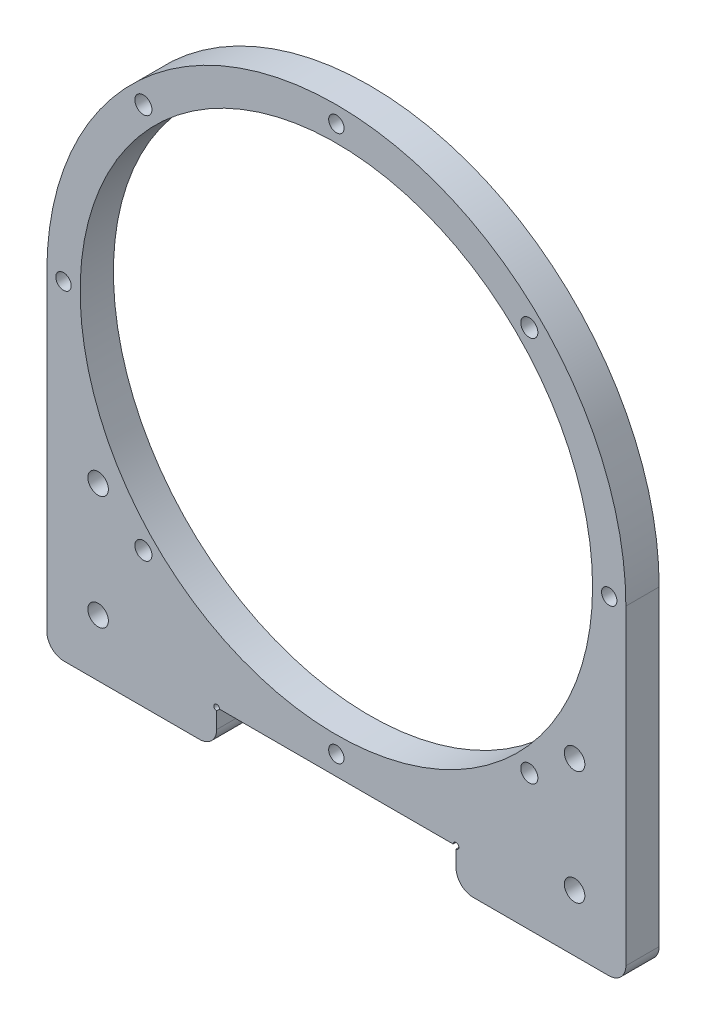
ISO-10303-21;
HEADER;
FILE_DESCRIPTION(('STEP AP214'),'2;1');
FILE_NAME('part.step','',(''),(''),'','','');
FILE_SCHEMA(('AUTOMOTIVE_DESIGN { 1 0 10303 214 1 1 1 1 }'));
ENDSEC;
DATA;
#1=APPLICATION_CONTEXT('core data for automotive mechanical design processes');
#2=APPLICATION_PROTOCOL_DEFINITION('international standard','automotive_design',2000,#1);
#3=PRODUCT_CONTEXT('',#1,'mechanical');
#4=PRODUCT('Part','Part','',(#3));
#5=PRODUCT_RELATED_PRODUCT_CATEGORY('part','',(#4));
#6=PRODUCT_DEFINITION_FORMATION('','',#4);
#7=PRODUCT_DEFINITION_CONTEXT('part definition',#1,'design');
#8=PRODUCT_DEFINITION('design','',#6,#7);
#9=PRODUCT_DEFINITION_SHAPE('','',#8);
#10=(LENGTH_UNIT() NAMED_UNIT(*) SI_UNIT(.MILLI.,.METRE.));
#11=(NAMED_UNIT(*) PLANE_ANGLE_UNIT() SI_UNIT($,.RADIAN.));
#12=(NAMED_UNIT(*) SI_UNIT($,.STERADIAN.) SOLID_ANGLE_UNIT());
#13=UNCERTAINTY_MEASURE_WITH_UNIT(LENGTH_MEASURE(1.E-05),#10,'distance_accuracy_value','');
#14=(GEOMETRIC_REPRESENTATION_CONTEXT(3) GLOBAL_UNCERTAINTY_ASSIGNED_CONTEXT((#13)) GLOBAL_UNIT_ASSIGNED_CONTEXT((#10,
#11,#12)) REPRESENTATION_CONTEXT('',''));
#15=CARTESIAN_POINT('',(0.,0.,0.));
#16=DIRECTION('',(0.,0.,1.));
#17=DIRECTION('',(1.,0.,0.));
#18=AXIS2_PLACEMENT_3D('',#15,#16,#17);
#19=CARTESIAN_POINT('',(0.,-57.658,5.842));
#20=DIRECTION('',(0.,1.,0.));
#21=DIRECTION('',(-1.,0.,0.));
#22=AXIS2_PLACEMENT_3D('',#19,#20,#21);
#23=PLANE('',#22);
#24=DIRECTION('',(1.,0.,0.));
#25=VECTOR('',#24,1.);
#26=CARTESIAN_POINT('',(0.,-57.658,0.));
#27=LINE('',#26,#25);
#28=CARTESIAN_POINT('',(-47.8,-57.658,0.));
#29=VERTEX_POINT('',#28);
#30=CARTESIAN_POINT('',(-24.,-57.658,0.));
#31=VERTEX_POINT('',#30);
#32=EDGE_CURVE('E262',#29,#31,#27,.T.);
#33=ORIENTED_EDGE('',*,*,#32,.T.);
#34=DIRECTION('',(0.,0.,1.));
#35=VECTOR('',#34,1.);
#36=CARTESIAN_POINT('',(-24.,-57.658,5.842));
#37=LINE('',#36,#35);
#38=CARTESIAN_POINT('',(-24.,-57.658,5.842));
#39=VERTEX_POINT('',#38);
#40=EDGE_CURVE('E308',#31,#39,#37,.T.);
#41=ORIENTED_EDGE('',*,*,#40,.T.);
#42=DIRECTION('',(1.,0.,0.));
#43=VECTOR('',#42,1.);
#44=CARTESIAN_POINT('',(0.,-57.658,5.842));
#45=LINE('',#44,#43);
#46=CARTESIAN_POINT('',(-47.8,-57.658,5.842));
#47=VERTEX_POINT('',#46);
#48=EDGE_CURVE('E208',#47,#39,#45,.T.);
#49=ORIENTED_EDGE('',*,*,#48,.F.);
#50=DIRECTION('',(0.,0.,-1.));
#51=VECTOR('',#50,1.);
#52=CARTESIAN_POINT('',(-47.8,-57.658,5.842));
#53=LINE('',#52,#51);
#54=EDGE_CURVE('E305',#47,#29,#53,.T.);
#55=ORIENTED_EDGE('',*,*,#54,.T.);
#56=EDGE_LOOP('',(#33,#41,#49,#55));
#57=FACE_BOUND('',#56,.T.);
#58=ADVANCED_FACE('F34',(#57),#23,.F.);
#59=CARTESIAN_POINT('',(0.,0.,5.842));
#60=DIRECTION('',(0.,0.,-1.));
#61=DIRECTION('',(-1.,0.,0.));
#62=AXIS2_PLACEMENT_3D('',#59,#60,#61);
#63=CYLINDRICAL_SURFACE('',#62,50.8);
#64=CARTESIAN_POINT('',(0.,0.,0.));
#65=DIRECTION('',(0.,0.,1.));
#66=DIRECTION('',(1.,0.,0.));
#67=AXIS2_PLACEMENT_3D('',#64,#65,#66);
#68=CIRCLE('',#67,50.8);
#69=CARTESIAN_POINT('',(-50.8,0.,0.));
#70=VERTEX_POINT('',#69);
#71=CARTESIAN_POINT('',(50.8,0.,0.));
#72=VERTEX_POINT('',#71);
#73=EDGE_CURVE('E253',#70,#72,#68,.F.);
#74=ORIENTED_EDGE('',*,*,#73,.F.);
#75=DIRECTION('',(0.,0.,-1.));
#76=VECTOR('',#75,1.);
#77=CARTESIAN_POINT('',(-50.8,0.,5.842));
#78=LINE('',#77,#76);
#79=CARTESIAN_POINT('',(-50.8,0.,5.842));
#80=VERTEX_POINT('',#79);
#81=EDGE_CURVE('E275',#80,#70,#78,.T.);
#82=ORIENTED_EDGE('',*,*,#81,.F.);
#83=CARTESIAN_POINT('',(0.,0.,5.842));
#84=DIRECTION('',(0.,0.,1.));
#85=DIRECTION('',(1.,0.,0.));
#86=AXIS2_PLACEMENT_3D('',#83,#84,#85);
#87=CIRCLE('',#86,50.8);
#88=CARTESIAN_POINT('',(50.8,0.,5.842));
#89=VERTEX_POINT('',#88);
#90=EDGE_CURVE('E201',#80,#89,#87,.F.);
#91=ORIENTED_EDGE('',*,*,#90,.T.);
#92=DIRECTION('',(0.,0.,-1.));
#93=VECTOR('',#92,1.);
#94=CARTESIAN_POINT('',(50.8,0.,5.842));
#95=LINE('',#94,#93);
#96=EDGE_CURVE('E222',#89,#72,#95,.T.);
#97=ORIENTED_EDGE('',*,*,#96,.T.);
#98=EDGE_LOOP('',(#74,#82,#91,#97));
#99=FACE_BOUND('',#98,.T.);
#100=ADVANCED_FACE('F336',(#99),#63,.T.);
#101=CARTESIAN_POINT('',(-50.8,0.,5.842));
#102=DIRECTION('',(1.,0.,0.));
#103=DIRECTION('',(0.,1.,0.));
#104=AXIS2_PLACEMENT_3D('',#101,#102,#103);
#105=PLANE('',#104);
#106=DIRECTION('',(0.,-1.,0.));
#107=VECTOR('',#106,1.);
#108=CARTESIAN_POINT('',(-50.8,0.,0.));
#109=LINE('',#108,#107);
#110=CARTESIAN_POINT('',(-50.8,-54.658,0.));
#111=VERTEX_POINT('',#110);
#112=EDGE_CURVE('E256',#70,#111,#109,.T.);
#113=ORIENTED_EDGE('',*,*,#112,.T.);
#114=DIRECTION('',(0.,0.,-1.));
#115=VECTOR('',#114,1.);
#116=CARTESIAN_POINT('',(-50.8,-54.658,5.842));
#117=LINE('',#116,#115);
#118=CARTESIAN_POINT('',(-50.8,-54.658,5.842));
#119=VERTEX_POINT('',#118);
#120=EDGE_CURVE('E11',#111,#119,#117,.F.);
#121=ORIENTED_EDGE('',*,*,#120,.T.);
#122=DIRECTION('',(0.,-1.,0.));
#123=VECTOR('',#122,1.);
#124=CARTESIAN_POINT('',(-50.8,0.,5.842));
#125=LINE('',#124,#123);
#126=EDGE_CURVE('E204',#80,#119,#125,.T.);
#127=ORIENTED_EDGE('',*,*,#126,.F.);
#128=ORIENTED_EDGE('',*,*,#81,.T.);
#129=EDGE_LOOP('',(#113,#121,#127,#128));
#130=FACE_BOUND('',#129,.T.);
#131=ADVANCED_FACE('F334',(#130),#105,.F.);
#132=CARTESIAN_POINT('',(24.,-57.658,0.));
#133=VERTEX_POINT('',#132);
#134=CARTESIAN_POINT('',(47.8,-57.658,0.));
#135=VERTEX_POINT('',#134);
#136=EDGE_CURVE('E259',#133,#135,#27,.T.);
#137=ORIENTED_EDGE('',*,*,#136,.T.);
#138=DIRECTION('',(0.,0.,-1.));
#139=VECTOR('',#138,1.);
#140=CARTESIAN_POINT('',(47.8,-57.658,5.842));
#141=LINE('',#140,#139);
#142=CARTESIAN_POINT('',(47.8,-57.658,5.842));
#143=VERTEX_POINT('',#142);
#144=EDGE_CURVE('E293',#135,#143,#141,.F.);
#145=ORIENTED_EDGE('',*,*,#144,.T.);
#146=CARTESIAN_POINT('',(24.,-57.658,5.842));
#147=VERTEX_POINT('',#146);
#148=EDGE_CURVE('E207',#147,#143,#45,.T.);
#149=ORIENTED_EDGE('',*,*,#148,.F.);
#150=DIRECTION('',(0.,0.,1.));
#151=VECTOR('',#150,1.);
#152=CARTESIAN_POINT('',(24.,-57.658,5.842));
#153=LINE('',#152,#151);
#154=EDGE_CURVE('E291',#147,#133,#153,.F.);
#155=ORIENTED_EDGE('',*,*,#154,.T.);
#156=EDGE_LOOP('',(#137,#145,#149,#155));
#157=FACE_BOUND('',#156,.T.);
#158=ADVANCED_FACE('F349',(#157),#23,.F.);
#159=CARTESIAN_POINT('',(0.,47.879,5.842));
#160=DIRECTION('',(0.,0.,-1.));
#161=DIRECTION('',(-1.,0.,0.));
#162=AXIS2_PLACEMENT_3D('',#159,#160,#161);
#163=CYLINDRICAL_SURFACE('',#162,1.35);
#164=CARTESIAN_POINT('',(0.,47.879,5.842));
#165=DIRECTION('',(0.,0.,1.));
#166=DIRECTION('',(1.,0.,0.));
#167=AXIS2_PLACEMENT_3D('',#164,#165,#166);
#168=CIRCLE('',#167,1.35);
#169=CARTESIAN_POINT('',(1.35,47.879,5.842));
#170=VERTEX_POINT('',#169);
#171=EDGE_CURVE('E216',#170,#170,#168,.T.);
#172=ORIENTED_EDGE('',*,*,#171,.T.);
#173=EDGE_LOOP('',(#172));
#174=FACE_BOUND('',#173,.T.);
#175=CARTESIAN_POINT('',(0.,47.879,0.));
#176=DIRECTION('',(0.,0.,1.));
#177=DIRECTION('',(1.,0.,0.));
#178=AXIS2_PLACEMENT_3D('',#175,#176,#177);
#179=CIRCLE('',#178,1.35);
#180=CARTESIAN_POINT('',(1.35,47.879,0.));
#181=VERTEX_POINT('',#180);
#182=EDGE_CURVE('E269',#181,#181,#179,.T.);
#183=ORIENTED_EDGE('',*,*,#182,.F.);
#184=EDGE_LOOP('',(#183));
#185=FACE_BOUND('',#184,.T.);
#186=ADVANCED_FACE('F385',(#174,#185),#163,.F.);
#187=CARTESIAN_POINT('',(-47.879,0.,5.842));
#188=DIRECTION('',(0.,0.,-1.));
#189=DIRECTION('',(-1.,0.,0.));
#190=AXIS2_PLACEMENT_3D('',#187,#188,#189);
#191=CYLINDRICAL_SURFACE('',#190,1.35);
#192=CARTESIAN_POINT('',(-47.879,0.,5.842));
#193=DIRECTION('',(0.,0.,1.));
#194=DIRECTION('',(1.,0.,0.));
#195=AXIS2_PLACEMENT_3D('',#192,#193,#194);
#196=CIRCLE('',#195,1.35);
#197=CARTESIAN_POINT('',(-46.529,0.,5.842));
#198=VERTEX_POINT('',#197);
#199=EDGE_CURVE('E213',#198,#198,#196,.T.);
#200=ORIENTED_EDGE('',*,*,#199,.T.);
#201=EDGE_LOOP('',(#200));
#202=FACE_BOUND('',#201,.T.);
#203=CARTESIAN_POINT('',(-47.879,0.,0.));
#204=DIRECTION('',(0.,0.,1.));
#205=DIRECTION('',(1.,0.,0.));
#206=AXIS2_PLACEMENT_3D('',#203,#204,#205);
#207=CIRCLE('',#206,1.35);
#208=CARTESIAN_POINT('',(-46.529,0.,0.));
#209=VERTEX_POINT('',#208);
#210=EDGE_CURVE('E266',#209,#209,#207,.T.);
#211=ORIENTED_EDGE('',*,*,#210,.F.);
#212=EDGE_LOOP('',(#211));
#213=FACE_BOUND('',#212,.T.);
#214=ADVANCED_FACE('F390',(#202,#213),#191,.F.);
#215=CARTESIAN_POINT('',(50.8,0.,5.842));
#216=DIRECTION('',(1.,0.,0.));
#217=DIRECTION('',(0.,1.,0.));
#218=AXIS2_PLACEMENT_3D('',#215,#216,#217);
#219=PLANE('',#218);
#220=DIRECTION('',(0.,-1.,0.));
#221=VECTOR('',#220,1.);
#222=CARTESIAN_POINT('',(50.8,0.,5.842));
#223=LINE('',#222,#221);
#224=CARTESIAN_POINT('',(50.8,-54.658,5.842));
#225=VERTEX_POINT('',#224);
#226=EDGE_CURVE('E210',#89,#225,#223,.T.);
#227=ORIENTED_EDGE('',*,*,#226,.T.);
#228=DIRECTION('',(0.,0.,-1.));
#229=VECTOR('',#228,1.);
#230=CARTESIAN_POINT('',(50.8,-54.658,0.));
#231=LINE('',#230,#229);
#232=CARTESIAN_POINT('',(50.8,-54.658,0.));
#233=VERTEX_POINT('',#232);
#234=EDGE_CURVE('E280',#225,#233,#231,.T.);
#235=ORIENTED_EDGE('',*,*,#234,.T.);
#236=DIRECTION('',(0.,-1.,0.));
#237=VECTOR('',#236,1.);
#238=CARTESIAN_POINT('',(50.8,0.,0.));
#239=LINE('',#238,#237);
#240=EDGE_CURVE('E263',#72,#233,#239,.T.);
#241=ORIENTED_EDGE('',*,*,#240,.F.);
#242=ORIENTED_EDGE('',*,*,#96,.F.);
#243=EDGE_LOOP('',(#227,#235,#241,#242));
#244=FACE_BOUND('',#243,.T.);
#245=ADVANCED_FACE('F340',(#244),#219,.T.);
#246=CARTESIAN_POINT('',(0.,0.,5.842));
#247=DIRECTION('',(0.,0.,-1.));
#248=DIRECTION('',(-1.,0.,0.));
#249=AXIS2_PLACEMENT_3D('',#246,#247,#248);
#250=CYLINDRICAL_SURFACE('',#249,44.958);
#251=CARTESIAN_POINT('',(0.,0.,5.842));
#252=DIRECTION('',(0.,0.,1.));
#253=DIRECTION('',(1.,0.,0.));
#254=AXIS2_PLACEMENT_3D('',#251,#252,#253);
#255=CIRCLE('',#254,44.958);
#256=CARTESIAN_POINT('',(44.958,0.,5.842));
#257=VERTEX_POINT('',#256);
#258=EDGE_CURVE('E198',#257,#257,#255,.T.);
#259=ORIENTED_EDGE('',*,*,#258,.T.);
#260=EDGE_LOOP('',(#259));
#261=FACE_BOUND('',#260,.T.);
#262=CARTESIAN_POINT('',(0.,0.,0.));
#263=DIRECTION('',(0.,0.,1.));
#264=DIRECTION('',(1.,0.,0.));
#265=AXIS2_PLACEMENT_3D('',#262,#263,#264);
#266=CIRCLE('',#265,44.958);
#267=CARTESIAN_POINT('',(44.958,0.,0.));
#268=VERTEX_POINT('',#267);
#269=EDGE_CURVE('E250',#268,#268,#266,.T.);
#270=ORIENTED_EDGE('',*,*,#269,.F.);
#271=EDGE_LOOP('',(#270));
#272=FACE_BOUND('',#271,.T.);
#273=ADVANCED_FACE('F396',(#261,#272),#250,.F.);
#274=CARTESIAN_POINT('',(41.8,-47.658,5.842));
#275=DIRECTION('',(0.,0.,-1.));
#276=DIRECTION('',(-1.,0.,0.));
#277=AXIS2_PLACEMENT_3D('',#274,#275,#276);
#278=CYLINDRICAL_SURFACE('',#277,1.8);
#279=CARTESIAN_POINT('',(41.8,-47.658,5.842));
#280=DIRECTION('',(0.,0.,1.));
#281=DIRECTION('',(1.,0.,0.));
#282=AXIS2_PLACEMENT_3D('',#279,#280,#281);
#283=CIRCLE('',#282,1.8);
#284=CARTESIAN_POINT('',(43.6,-47.658,5.842));
#285=VERTEX_POINT('',#284);
#286=EDGE_CURVE('E195',#285,#285,#283,.F.);
#287=ORIENTED_EDGE('',*,*,#286,.F.);
#288=EDGE_LOOP('',(#287));
#289=FACE_BOUND('',#288,.T.);
#290=CARTESIAN_POINT('',(41.8,-47.658,0.));
#291=DIRECTION('',(0.,0.,1.));
#292=DIRECTION('',(1.,0.,0.));
#293=AXIS2_PLACEMENT_3D('',#290,#291,#292);
#294=CIRCLE('',#293,1.8);
#295=CARTESIAN_POINT('',(43.6,-47.658,0.));
#296=VERTEX_POINT('',#295);
#297=EDGE_CURVE('E247',#296,#296,#294,.F.);
#298=ORIENTED_EDGE('',*,*,#297,.T.);
#299=EDGE_LOOP('',(#298));
#300=FACE_BOUND('',#299,.T.);
#301=ADVANCED_FACE('F399',(#289,#300),#278,.F.);
#302=CARTESIAN_POINT('',(47.879,0.,5.842));
#303=DIRECTION('',(0.,0.,-1.));
#304=DIRECTION('',(-1.,0.,0.));
#305=AXIS2_PLACEMENT_3D('',#302,#303,#304);
#306=CYLINDRICAL_SURFACE('',#305,1.35);
#307=CARTESIAN_POINT('',(47.879,0.,5.842));
#308=DIRECTION('',(0.,0.,1.));
#309=DIRECTION('',(1.,0.,0.));
#310=AXIS2_PLACEMENT_3D('',#307,#308,#309);
#311=CIRCLE('',#310,1.35);
#312=CARTESIAN_POINT('',(49.229,0.,5.842));
#313=VERTEX_POINT('',#312);
#314=EDGE_CURVE('E192',#313,#313,#311,.T.);
#315=ORIENTED_EDGE('',*,*,#314,.T.);
#316=EDGE_LOOP('',(#315));
#317=FACE_BOUND('',#316,.T.);
#318=CARTESIAN_POINT('',(47.879,0.,0.));
#319=DIRECTION('',(0.,0.,1.));
#320=DIRECTION('',(1.,0.,0.));
#321=AXIS2_PLACEMENT_3D('',#318,#319,#320);
#322=CIRCLE('',#321,1.35);
#323=CARTESIAN_POINT('',(49.229,0.,0.));
#324=VERTEX_POINT('',#323);
#325=EDGE_CURVE('E244',#324,#324,#322,.T.);
#326=ORIENTED_EDGE('',*,*,#325,.F.);
#327=EDGE_LOOP('',(#326));
#328=FACE_BOUND('',#327,.T.);
#329=ADVANCED_FACE('F403',(#317,#328),#306,.F.);
#330=CARTESIAN_POINT('',(0.,-47.879,5.842));
#331=DIRECTION('',(0.,0.,-1.));
#332=DIRECTION('',(-1.,0.,0.));
#333=AXIS2_PLACEMENT_3D('',#330,#331,#332);
#334=CYLINDRICAL_SURFACE('',#333,1.35);
#335=CARTESIAN_POINT('',(0.,-47.879,5.842));
#336=DIRECTION('',(0.,0.,1.));
#337=DIRECTION('',(1.,0.,0.));
#338=AXIS2_PLACEMENT_3D('',#335,#336,#337);
#339=CIRCLE('',#338,1.35);
#340=CARTESIAN_POINT('',(1.35000000000001,-47.879,5.842));
#341=VERTEX_POINT('',#340);
#342=EDGE_CURVE('E189',#341,#341,#339,.T.);
#343=ORIENTED_EDGE('',*,*,#342,.T.);
#344=EDGE_LOOP('',(#343));
#345=FACE_BOUND('',#344,.T.);
#346=CARTESIAN_POINT('',(0.,-47.879,0.));
#347=DIRECTION('',(0.,0.,1.));
#348=DIRECTION('',(1.,0.,0.));
#349=AXIS2_PLACEMENT_3D('',#346,#347,#348);
#350=CIRCLE('',#349,1.35);
#351=CARTESIAN_POINT('',(1.35000000000001,-47.879,0.));
#352=VERTEX_POINT('',#351);
#353=EDGE_CURVE('E241',#352,#352,#350,.T.);
#354=ORIENTED_EDGE('',*,*,#353,.F.);
#355=EDGE_LOOP('',(#354));
#356=FACE_BOUND('',#355,.T.);
#357=ADVANCED_FACE('F407',(#345,#356),#334,.F.);
#358=CARTESIAN_POINT('',(-41.8,-27.658,5.842));
#359=DIRECTION('',(0.,0.,-1.));
#360=DIRECTION('',(-1.,0.,0.));
#361=AXIS2_PLACEMENT_3D('',#358,#359,#360);
#362=CYLINDRICAL_SURFACE('',#361,1.8);
#363=CARTESIAN_POINT('',(-41.8,-27.658,5.842));
#364=DIRECTION('',(0.,0.,1.));
#365=DIRECTION('',(1.,0.,0.));
#366=AXIS2_PLACEMENT_3D('',#363,#364,#365);
#367=CIRCLE('',#366,1.8);
#368=CARTESIAN_POINT('',(-40.,-27.658,5.842));
#369=VERTEX_POINT('',#368);
#370=EDGE_CURVE('E186',#369,#369,#367,.T.);
#371=ORIENTED_EDGE('',*,*,#370,.T.);
#372=EDGE_LOOP('',(#371));
#373=FACE_BOUND('',#372,.T.);
#374=CARTESIAN_POINT('',(-41.8,-27.658,0.));
#375=DIRECTION('',(0.,0.,1.));
#376=DIRECTION('',(1.,0.,0.));
#377=AXIS2_PLACEMENT_3D('',#374,#375,#376);
#378=CIRCLE('',#377,1.8);
#379=CARTESIAN_POINT('',(-40.,-27.658,0.));
#380=VERTEX_POINT('',#379);
#381=EDGE_CURVE('E238',#380,#380,#378,.T.);
#382=ORIENTED_EDGE('',*,*,#381,.F.);
#383=EDGE_LOOP('',(#382));
#384=FACE_BOUND('',#383,.T.);
#385=ADVANCED_FACE('F411',(#373,#384),#362,.F.);
#386=CARTESIAN_POINT('',(-33.8555655764305,33.8555655764309,5.842));
#387=DIRECTION('',(0.,0.,-1.));
#388=DIRECTION('',(-1.,0.,0.));
#389=AXIS2_PLACEMENT_3D('',#386,#387,#388);
#390=CYLINDRICAL_SURFACE('',#389,1.5);
#391=CARTESIAN_POINT('',(-33.8555655764305,33.8555655764309,5.842));
#392=DIRECTION('',(0.,0.,1.));
#393=DIRECTION('',(1.,0.,0.));
#394=AXIS2_PLACEMENT_3D('',#391,#392,#393);
#395=CIRCLE('',#394,1.5);
#396=CARTESIAN_POINT('',(-32.3555655764305,33.8555655764309,5.842));
#397=VERTEX_POINT('',#396);
#398=EDGE_CURVE('E183',#397,#397,#395,.T.);
#399=ORIENTED_EDGE('',*,*,#398,.T.);
#400=EDGE_LOOP('',(#399));
#401=FACE_BOUND('',#400,.T.);
#402=CARTESIAN_POINT('',(-33.8555655764305,33.8555655764309,0.));
#403=DIRECTION('',(0.,0.,1.));
#404=DIRECTION('',(1.,0.,0.));
#405=AXIS2_PLACEMENT_3D('',#402,#403,#404);
#406=CIRCLE('',#405,1.5);
#407=CARTESIAN_POINT('',(-32.3555655764305,33.8555655764309,0.));
#408=VERTEX_POINT('',#407);
#409=EDGE_CURVE('E235',#408,#408,#406,.T.);
#410=ORIENTED_EDGE('',*,*,#409,.F.);
#411=EDGE_LOOP('',(#410));
#412=FACE_BOUND('',#411,.T.);
#413=ADVANCED_FACE('F415',(#401,#412),#390,.F.);
#414=CARTESIAN_POINT('',(33.8555655764309,33.8555655764305,5.842));
#415=DIRECTION('',(0.,0.,-1.));
#416=DIRECTION('',(-1.,0.,0.));
#417=AXIS2_PLACEMENT_3D('',#414,#415,#416);
#418=CYLINDRICAL_SURFACE('',#417,1.5);
#419=CARTESIAN_POINT('',(33.8555655764309,33.8555655764305,5.842));
#420=DIRECTION('',(0.,0.,1.));
#421=DIRECTION('',(1.,0.,0.));
#422=AXIS2_PLACEMENT_3D('',#419,#420,#421);
#423=CIRCLE('',#422,1.5);
#424=CARTESIAN_POINT('',(35.3555655764309,33.8555655764305,5.842));
#425=VERTEX_POINT('',#424);
#426=EDGE_CURVE('E180',#425,#425,#423,.T.);
#427=ORIENTED_EDGE('',*,*,#426,.T.);
#428=EDGE_LOOP('',(#427));
#429=FACE_BOUND('',#428,.T.);
#430=CARTESIAN_POINT('',(33.8555655764309,33.8555655764305,0.));
#431=DIRECTION('',(0.,0.,1.));
#432=DIRECTION('',(1.,0.,0.));
#433=AXIS2_PLACEMENT_3D('',#430,#431,#432);
#434=CIRCLE('',#433,1.5);
#435=CARTESIAN_POINT('',(35.3555655764309,33.8555655764305,0.));
#436=VERTEX_POINT('',#435);
#437=EDGE_CURVE('E232',#436,#436,#434,.T.);
#438=ORIENTED_EDGE('',*,*,#437,.F.);
#439=EDGE_LOOP('',(#438));
#440=FACE_BOUND('',#439,.T.);
#441=ADVANCED_FACE('F419',(#429,#440),#418,.F.);
#442=CARTESIAN_POINT('',(33.8555655764305,-33.8555655764309,5.842));
#443=DIRECTION('',(0.,0.,-1.));
#444=DIRECTION('',(-1.,0.,0.));
#445=AXIS2_PLACEMENT_3D('',#442,#443,#444);
#446=CYLINDRICAL_SURFACE('',#445,1.50000000000001);
#447=CARTESIAN_POINT('',(33.8555655764305,-33.8555655764309,5.842));
#448=DIRECTION('',(0.,0.,1.));
#449=DIRECTION('',(1.,0.,0.));
#450=AXIS2_PLACEMENT_3D('',#447,#448,#449);
#451=CIRCLE('',#450,1.50000000000001);
#452=CARTESIAN_POINT('',(35.3555655764305,-33.8555655764309,5.842));
#453=VERTEX_POINT('',#452);
#454=EDGE_CURVE('E177',#453,#453,#451,.T.);
#455=ORIENTED_EDGE('',*,*,#454,.T.);
#456=EDGE_LOOP('',(#455));
#457=FACE_BOUND('',#456,.T.);
#458=CARTESIAN_POINT('',(33.8555655764305,-33.8555655764309,0.));
#459=DIRECTION('',(0.,0.,1.));
#460=DIRECTION('',(1.,0.,0.));
#461=AXIS2_PLACEMENT_3D('',#458,#459,#460);
#462=CIRCLE('',#461,1.50000000000001);
#463=CARTESIAN_POINT('',(35.3555655764305,-33.8555655764309,0.));
#464=VERTEX_POINT('',#463);
#465=EDGE_CURVE('E229',#464,#464,#462,.T.);
#466=ORIENTED_EDGE('',*,*,#465,.F.);
#467=EDGE_LOOP('',(#466));
#468=FACE_BOUND('',#467,.T.);
#469=ADVANCED_FACE('F423',(#457,#468),#446,.F.);
#470=CARTESIAN_POINT('',(-33.8555655764309,-33.8555655764305,5.842));
#471=DIRECTION('',(0.,0.,-1.));
#472=DIRECTION('',(-1.,0.,0.));
#473=AXIS2_PLACEMENT_3D('',#470,#471,#472);
#474=CYLINDRICAL_SURFACE('',#473,1.50000000000001);
#475=CARTESIAN_POINT('',(-33.8555655764309,-33.8555655764305,5.842));
#476=DIRECTION('',(0.,0.,1.));
#477=DIRECTION('',(1.,0.,0.));
#478=AXIS2_PLACEMENT_3D('',#475,#476,#477);
#479=CIRCLE('',#478,1.50000000000001);
#480=CARTESIAN_POINT('',(-32.3555655764309,-33.8555655764305,5.842));
#481=VERTEX_POINT('',#480);
#482=EDGE_CURVE('E173',#481,#481,#479,.T.);
#483=ORIENTED_EDGE('',*,*,#482,.T.);
#484=EDGE_LOOP('',(#483));
#485=FACE_BOUND('',#484,.T.);
#486=CARTESIAN_POINT('',(-33.8555655764309,-33.8555655764305,0.));
#487=DIRECTION('',(0.,0.,1.));
#488=DIRECTION('',(1.,0.,0.));
#489=AXIS2_PLACEMENT_3D('',#486,#487,#488);
#490=CIRCLE('',#489,1.50000000000001);
#491=CARTESIAN_POINT('',(-32.3555655764309,-33.8555655764305,0.));
#492=VERTEX_POINT('',#491);
#493=EDGE_CURVE('E226',#492,#492,#490,.T.);
#494=ORIENTED_EDGE('',*,*,#493,.F.);
#495=EDGE_LOOP('',(#494));
#496=FACE_BOUND('',#495,.T.);
#497=ADVANCED_FACE('F427',(#485,#496),#474,.F.);
#498=CARTESIAN_POINT('',(-41.8,-47.658,5.842));
#499=DIRECTION('',(0.,0.,-1.));
#500=DIRECTION('',(-1.,0.,0.));
#501=AXIS2_PLACEMENT_3D('',#498,#499,#500);
#502=CYLINDRICAL_SURFACE('',#501,1.8);
#503=CARTESIAN_POINT('',(-41.8,-47.658,5.842));
#504=DIRECTION('',(0.,0.,1.));
#505=DIRECTION('',(1.,0.,0.));
#506=AXIS2_PLACEMENT_3D('',#503,#504,#505);
#507=CIRCLE('',#506,1.8);
#508=CARTESIAN_POINT('',(-40.,-47.658,5.842));
#509=VERTEX_POINT('',#508);
#510=EDGE_CURVE('E170',#509,#509,#507,.T.);
#511=ORIENTED_EDGE('',*,*,#510,.T.);
#512=EDGE_LOOP('',(#511));
#513=FACE_BOUND('',#512,.T.);
#514=CARTESIAN_POINT('',(-41.8,-47.658,0.));
#515=DIRECTION('',(0.,0.,1.));
#516=DIRECTION('',(1.,0.,0.));
#517=AXIS2_PLACEMENT_3D('',#514,#515,#516);
#518=CIRCLE('',#517,1.8);
#519=CARTESIAN_POINT('',(-40.,-47.658,0.));
#520=VERTEX_POINT('',#519);
#521=EDGE_CURVE('E223',#520,#520,#518,.T.);
#522=ORIENTED_EDGE('',*,*,#521,.F.);
#523=EDGE_LOOP('',(#522));
#524=FACE_BOUND('',#523,.T.);
#525=ADVANCED_FACE('F431',(#513,#524),#502,.F.);
#526=CARTESIAN_POINT('',(41.8,-27.658,5.842));
#527=DIRECTION('',(0.,0.,-1.));
#528=DIRECTION('',(-1.,0.,0.));
#529=AXIS2_PLACEMENT_3D('',#526,#527,#528);
#530=CYLINDRICAL_SURFACE('',#529,1.8);
#531=CARTESIAN_POINT('',(41.8,-27.658,5.842));
#532=DIRECTION('',(0.,0.,1.));
#533=DIRECTION('',(1.,0.,0.));
#534=AXIS2_PLACEMENT_3D('',#531,#532,#533);
#535=CIRCLE('',#534,1.8);
#536=CARTESIAN_POINT('',(43.6,-27.658,5.842));
#537=VERTEX_POINT('',#536);
#538=EDGE_CURVE('E219',#537,#537,#535,.F.);
#539=ORIENTED_EDGE('',*,*,#538,.F.);
#540=EDGE_LOOP('',(#539));
#541=FACE_BOUND('',#540,.T.);
#542=CARTESIAN_POINT('',(41.8,-27.658,0.));
#543=DIRECTION('',(0.,0.,1.));
#544=DIRECTION('',(1.,0.,0.));
#545=AXIS2_PLACEMENT_3D('',#542,#543,#544);
#546=CIRCLE('',#545,1.8);
#547=CARTESIAN_POINT('',(43.6,-27.658,0.));
#548=VERTEX_POINT('',#547);
#549=EDGE_CURVE('E174',#548,#548,#546,.F.);
#550=ORIENTED_EDGE('',*,*,#549,.T.);
#551=EDGE_LOOP('',(#550));
#552=FACE_BOUND('',#551,.T.);
#553=ADVANCED_FACE('F435',(#541,#552),#530,.F.);
#554=CARTESIAN_POINT('',(0.,0.,5.842));
#555=DIRECTION('',(0.,0.,1.));
#556=DIRECTION('',(1.,0.,0.));
#557=AXIS2_PLACEMENT_3D('',#554,#555,#556);
#558=PLANE('',#557);
#559=ORIENTED_EDGE('',*,*,#148,.T.);
#560=CARTESIAN_POINT('',(47.8,-54.658,5.842));
#561=DIRECTION('',(0.,0.,1.));
#562=DIRECTION('',(1.,0.,0.));
#563=AXIS2_PLACEMENT_3D('',#560,#561,#562);
#564=CIRCLE('',#563,3.);
#565=EDGE_CURVE('E300',#143,#225,#564,.T.);
#566=ORIENTED_EDGE('',*,*,#565,.T.);
#567=ORIENTED_EDGE('',*,*,#226,.F.);
#568=ORIENTED_EDGE('',*,*,#90,.F.);
#569=ORIENTED_EDGE('',*,*,#126,.T.);
#570=CARTESIAN_POINT('',(-47.8,-54.658,5.842));
#571=DIRECTION('',(0.,0.,1.));
#572=DIRECTION('',(1.,0.,0.));
#573=AXIS2_PLACEMENT_3D('',#570,#571,#572);
#574=CIRCLE('',#573,3.);
#575=EDGE_CURVE('E295',#119,#47,#574,.T.);
#576=ORIENTED_EDGE('',*,*,#575,.T.);
#577=ORIENTED_EDGE('',*,*,#48,.T.);
#578=CARTESIAN_POINT('',(-24.,-54.658,5.842));
#579=DIRECTION('',(0.,0.,1.));
#580=DIRECTION('',(1.,0.,0.));
#581=AXIS2_PLACEMENT_3D('',#578,#579,#580);
#582=CIRCLE('',#581,3.);
#583=CARTESIAN_POINT('',(-21.,-54.658,5.842));
#584=VERTEX_POINT('',#583);
#585=EDGE_CURVE('E49',#39,#584,#582,.T.);
#586=ORIENTED_EDGE('',*,*,#585,.T.);
#587=DIRECTION('',(0.,-1.,0.));
#588=VECTOR('',#587,1.);
#589=CARTESIAN_POINT('',(-21.,-57.658,5.842));
#590=LINE('',#589,#588);
#591=CARTESIAN_POINT('',(-21.,-51.808,5.842));
#592=VERTEX_POINT('',#591);
#593=EDGE_CURVE('E166',#592,#584,#590,.T.);
#594=ORIENTED_EDGE('',*,*,#593,.F.);
#595=CARTESIAN_POINT('',(-21.,-51.308,5.842));
#596=DIRECTION('',(0.,0.,1.));
#597=DIRECTION('',(1.,0.,0.));
#598=AXIS2_PLACEMENT_3D('',#595,#596,#597);
#599=CIRCLE('',#598,0.499999999999999);
#600=CARTESIAN_POINT('',(-20.5,-51.308,5.842));
#601=VERTEX_POINT('',#600);
#602=EDGE_CURVE('E154',#601,#592,#599,.T.);
#603=ORIENTED_EDGE('',*,*,#602,.F.);
#604=DIRECTION('',(-1.,0.,0.));
#605=VECTOR('',#604,1.);
#606=CARTESIAN_POINT('',(-21.,-51.308,5.842));
#607=LINE('',#606,#605);
#608=CARTESIAN_POINT('',(20.5,-51.308,5.842));
#609=VERTEX_POINT('',#608);
#610=EDGE_CURVE('E151',#609,#601,#607,.T.);
#611=ORIENTED_EDGE('',*,*,#610,.F.);
#612=CARTESIAN_POINT('',(21.,-51.308,5.842));
#613=DIRECTION('',(0.,0.,1.));
#614=DIRECTION('',(1.,0.,0.));
#615=AXIS2_PLACEMENT_3D('',#612,#613,#614);
#616=CIRCLE('',#615,0.499999999999999);
#617=CARTESIAN_POINT('',(21.,-51.808,5.842));
#618=VERTEX_POINT('',#617);
#619=EDGE_CURVE('E135',#618,#609,#616,.T.);
#620=ORIENTED_EDGE('',*,*,#619,.F.);
#621=DIRECTION('',(0.,1.,0.));
#622=VECTOR('',#621,1.);
#623=CARTESIAN_POINT('',(21.,-57.658,5.842));
#624=LINE('',#623,#622);
#625=CARTESIAN_POINT('',(21.,-54.658,5.842));
#626=VERTEX_POINT('',#625);
#627=EDGE_CURVE('E161',#626,#618,#624,.T.);
#628=ORIENTED_EDGE('',*,*,#627,.F.);
#629=CARTESIAN_POINT('',(24.,-54.658,5.842));
#630=DIRECTION('',(0.,0.,1.));
#631=DIRECTION('',(1.,0.,0.));
#632=AXIS2_PLACEMENT_3D('',#629,#630,#631);
#633=CIRCLE('',#632,3.);
#634=EDGE_CURVE('E298',#626,#147,#633,.T.);
#635=ORIENTED_EDGE('',*,*,#634,.T.);
#636=EDGE_LOOP('',(#559,#566,#567,#568,#569,#576,#577,#586,#594,#603,#611,#620,#628,#635));
#637=FACE_BOUND('',#636,.T.);
#638=ORIENTED_EDGE('',*,*,#510,.F.);
#639=EDGE_LOOP('',(#638));
#640=FACE_BOUND('',#639,.T.);
#641=ORIENTED_EDGE('',*,*,#482,.F.);
#642=EDGE_LOOP('',(#641));
#643=FACE_BOUND('',#642,.T.);
#644=ORIENTED_EDGE('',*,*,#454,.F.);
#645=EDGE_LOOP('',(#644));
#646=FACE_BOUND('',#645,.T.);
#647=ORIENTED_EDGE('',*,*,#426,.F.);
#648=EDGE_LOOP('',(#647));
#649=FACE_BOUND('',#648,.T.);
#650=ORIENTED_EDGE('',*,*,#398,.F.);
#651=EDGE_LOOP('',(#650));
#652=FACE_BOUND('',#651,.T.);
#653=ORIENTED_EDGE('',*,*,#370,.F.);
#654=EDGE_LOOP('',(#653));
#655=FACE_BOUND('',#654,.T.);
#656=ORIENTED_EDGE('',*,*,#342,.F.);
#657=EDGE_LOOP('',(#656));
#658=FACE_BOUND('',#657,.T.);
#659=ORIENTED_EDGE('',*,*,#314,.F.);
#660=EDGE_LOOP('',(#659));
#661=FACE_BOUND('',#660,.T.);
#662=ORIENTED_EDGE('',*,*,#286,.T.);
#663=EDGE_LOOP('',(#662));
#664=FACE_BOUND('',#663,.T.);
#665=ORIENTED_EDGE('',*,*,#258,.F.);
#666=EDGE_LOOP('',(#665));
#667=FACE_BOUND('',#666,.T.);
#668=ORIENTED_EDGE('',*,*,#199,.F.);
#669=EDGE_LOOP('',(#668));
#670=FACE_BOUND('',#669,.T.);
#671=ORIENTED_EDGE('',*,*,#171,.F.);
#672=EDGE_LOOP('',(#671));
#673=FACE_BOUND('',#672,.T.);
#674=ORIENTED_EDGE('',*,*,#538,.T.);
#675=EDGE_LOOP('',(#674));
#676=FACE_BOUND('',#675,.T.);
#677=ADVANCED_FACE('F158',(#637,#640,#643,#646,#649,#652,#655,#658,#661,#664,#667,#670,#673,
#676),#558,.T.);
#678=CARTESIAN_POINT('',(0.,0.,0.));
#679=DIRECTION('',(0.,0.,1.));
#680=DIRECTION('',(1.,0.,0.));
#681=AXIS2_PLACEMENT_3D('',#678,#679,#680);
#682=PLANE('',#681);
#683=ORIENTED_EDGE('',*,*,#521,.T.);
#684=EDGE_LOOP('',(#683));
#685=FACE_BOUND('',#684,.T.);
#686=ORIENTED_EDGE('',*,*,#493,.T.);
#687=EDGE_LOOP('',(#686));
#688=FACE_BOUND('',#687,.T.);
#689=ORIENTED_EDGE('',*,*,#465,.T.);
#690=EDGE_LOOP('',(#689));
#691=FACE_BOUND('',#690,.T.);
#692=ORIENTED_EDGE('',*,*,#437,.T.);
#693=EDGE_LOOP('',(#692));
#694=FACE_BOUND('',#693,.T.);
#695=ORIENTED_EDGE('',*,*,#409,.T.);
#696=EDGE_LOOP('',(#695));
#697=FACE_BOUND('',#696,.T.);
#698=ORIENTED_EDGE('',*,*,#381,.T.);
#699=EDGE_LOOP('',(#698));
#700=FACE_BOUND('',#699,.T.);
#701=ORIENTED_EDGE('',*,*,#353,.T.);
#702=EDGE_LOOP('',(#701));
#703=FACE_BOUND('',#702,.T.);
#704=ORIENTED_EDGE('',*,*,#325,.T.);
#705=EDGE_LOOP('',(#704));
#706=FACE_BOUND('',#705,.T.);
#707=ORIENTED_EDGE('',*,*,#297,.F.);
#708=EDGE_LOOP('',(#707));
#709=FACE_BOUND('',#708,.T.);
#710=ORIENTED_EDGE('',*,*,#269,.T.);
#711=EDGE_LOOP('',(#710));
#712=FACE_BOUND('',#711,.T.);
#713=ORIENTED_EDGE('',*,*,#240,.T.);
#714=CARTESIAN_POINT('',(47.8,-54.658,0.));
#715=DIRECTION('',(0.,0.,1.));
#716=DIRECTION('',(1.,0.,0.));
#717=AXIS2_PLACEMENT_3D('',#714,#715,#716);
#718=CIRCLE('',#717,3.);
#719=EDGE_CURVE('E289',#233,#135,#718,.F.);
#720=ORIENTED_EDGE('',*,*,#719,.T.);
#721=ORIENTED_EDGE('',*,*,#136,.F.);
#722=CARTESIAN_POINT('',(24.,-54.658,0.));
#723=DIRECTION('',(0.,0.,1.));
#724=DIRECTION('',(1.,0.,0.));
#725=AXIS2_PLACEMENT_3D('',#722,#723,#724);
#726=CIRCLE('',#725,3.);
#727=CARTESIAN_POINT('',(21.,-54.658,0.));
#728=VERTEX_POINT('',#727);
#729=EDGE_CURVE('E287',#133,#728,#726,.F.);
#730=ORIENTED_EDGE('',*,*,#729,.T.);
#731=DIRECTION('',(0.,1.,0.));
#732=VECTOR('',#731,1.);
#733=CARTESIAN_POINT('',(21.,-57.658,0.));
#734=LINE('',#733,#732);
#735=CARTESIAN_POINT('',(21.,-51.808,0.));
#736=VERTEX_POINT('',#735);
#737=EDGE_CURVE('E164',#728,#736,#734,.T.);
#738=ORIENTED_EDGE('',*,*,#737,.T.);
#739=CARTESIAN_POINT('',(21.,-51.308,0.));
#740=DIRECTION('',(0.,0.,1.));
#741=DIRECTION('',(1.,0.,0.));
#742=AXIS2_PLACEMENT_3D('',#739,#740,#741);
#743=CIRCLE('',#742,0.499999999999999);
#744=CARTESIAN_POINT('',(20.5,-51.308,0.));
#745=VERTEX_POINT('',#744);
#746=EDGE_CURVE('E145',#736,#745,#743,.T.);
#747=ORIENTED_EDGE('',*,*,#746,.T.);
#748=DIRECTION('',(-1.,0.,0.));
#749=VECTOR('',#748,1.);
#750=CARTESIAN_POINT('',(-21.,-51.308,0.));
#751=LINE('',#750,#749);
#752=CARTESIAN_POINT('',(-20.5,-51.308,0.));
#753=VERTEX_POINT('',#752);
#754=EDGE_CURVE('E153',#745,#753,#751,.T.);
#755=ORIENTED_EDGE('',*,*,#754,.T.);
#756=CARTESIAN_POINT('',(-21.,-51.308,0.));
#757=DIRECTION('',(0.,0.,1.));
#758=DIRECTION('',(1.,0.,0.));
#759=AXIS2_PLACEMENT_3D('',#756,#757,#758);
#760=CIRCLE('',#759,0.499999999999999);
#761=CARTESIAN_POINT('',(-21.,-51.808,0.));
#762=VERTEX_POINT('',#761);
#763=EDGE_CURVE('E321',#753,#762,#760,.T.);
#764=ORIENTED_EDGE('',*,*,#763,.T.);
#765=DIRECTION('',(0.,-1.,0.));
#766=VECTOR('',#765,1.);
#767=CARTESIAN_POINT('',(-21.,-57.658,0.));
#768=LINE('',#767,#766);
#769=CARTESIAN_POINT('',(-21.,-54.658,0.));
#770=VERTEX_POINT('',#769);
#771=EDGE_CURVE('E160',#762,#770,#768,.T.);
#772=ORIENTED_EDGE('',*,*,#771,.T.);
#773=CARTESIAN_POINT('',(-24.,-54.658,0.));
#774=DIRECTION('',(0.,0.,1.));
#775=DIRECTION('',(1.,0.,0.));
#776=AXIS2_PLACEMENT_3D('',#773,#774,#775);
#777=CIRCLE('',#776,3.);
#778=EDGE_CURVE('E285',#770,#31,#777,.F.);
#779=ORIENTED_EDGE('',*,*,#778,.T.);
#780=ORIENTED_EDGE('',*,*,#32,.F.);
#781=CARTESIAN_POINT('',(-47.8,-54.658,0.));
#782=DIRECTION('',(0.,0.,1.));
#783=DIRECTION('',(1.,0.,0.));
#784=AXIS2_PLACEMENT_3D('',#781,#782,#783);
#785=CIRCLE('',#784,3.);
#786=EDGE_CURVE('E283',#29,#111,#785,.F.);
#787=ORIENTED_EDGE('',*,*,#786,.T.);
#788=ORIENTED_EDGE('',*,*,#112,.F.);
#789=ORIENTED_EDGE('',*,*,#73,.T.);
#790=EDGE_LOOP('',(#713,#720,#721,#730,#738,#747,#755,#764,#772,#779,#780,#787,#788,#789));
#791=FACE_BOUND('',#790,.T.);
#792=ORIENTED_EDGE('',*,*,#210,.T.);
#793=EDGE_LOOP('',(#792));
#794=FACE_BOUND('',#793,.T.);
#795=ORIENTED_EDGE('',*,*,#182,.T.);
#796=EDGE_LOOP('',(#795));
#797=FACE_BOUND('',#796,.T.);
#798=ORIENTED_EDGE('',*,*,#549,.F.);
#799=EDGE_LOOP('',(#798));
#800=FACE_BOUND('',#799,.T.);
#801=ADVANCED_FACE('F316',(#685,#688,#691,#694,#697,#700,#703,#706,#709,#712,#791,#794,#797,
#800),#682,.F.);
#802=CARTESIAN_POINT('',(-21.,-57.658,0.));
#803=DIRECTION('',(-1.,0.,0.));
#804=DIRECTION('',(0.,-1.,0.));
#805=AXIS2_PLACEMENT_3D('',#802,#803,#804);
#806=PLANE('',#805);
#807=ORIENTED_EDGE('',*,*,#593,.T.);
#808=DIRECTION('',(0.,0.,1.));
#809=VECTOR('',#808,1.);
#810=CARTESIAN_POINT('',(-21.,-54.658,0.));
#811=LINE('',#810,#809);
#812=EDGE_CURVE('E42',#584,#770,#811,.F.);
#813=ORIENTED_EDGE('',*,*,#812,.T.);
#814=ORIENTED_EDGE('',*,*,#771,.F.);
#815=DIRECTION('',(0.,0.,1.));
#816=VECTOR('',#815,1.);
#817=CARTESIAN_POINT('',(-21.,-51.808,0.));
#818=LINE('',#817,#816);
#819=EDGE_CURVE('E361',#762,#592,#818,.T.);
#820=ORIENTED_EDGE('',*,*,#819,.T.);
#821=EDGE_LOOP('',(#807,#813,#814,#820));
#822=FACE_BOUND('',#821,.T.);
#823=ADVANCED_FACE('F311',(#822),#806,.F.);
#824=CARTESIAN_POINT('',(-21.,-51.308,0.));
#825=DIRECTION('',(0.,1.,0.));
#826=DIRECTION('',(-1.,0.,0.));
#827=AXIS2_PLACEMENT_3D('',#824,#825,#826);
#828=PLANE('',#827);
#829=ORIENTED_EDGE('',*,*,#754,.F.);
#830=DIRECTION('',(0.,0.,1.));
#831=VECTOR('',#830,1.);
#832=CARTESIAN_POINT('',(20.5,-51.308,0.));
#833=LINE('',#832,#831);
#834=EDGE_CURVE('E139',#745,#609,#833,.T.);
#835=ORIENTED_EDGE('',*,*,#834,.T.);
#836=ORIENTED_EDGE('',*,*,#610,.T.);
#837=DIRECTION('',(0.,0.,1.));
#838=VECTOR('',#837,1.);
#839=CARTESIAN_POINT('',(-20.5,-51.308,0.));
#840=LINE('',#839,#838);
#841=EDGE_CURVE('E277',#601,#753,#840,.F.);
#842=ORIENTED_EDGE('',*,*,#841,.T.);
#843=EDGE_LOOP('',(#829,#835,#836,#842));
#844=FACE_BOUND('',#843,.T.);
#845=ADVANCED_FACE('F149',(#844),#828,.F.);
#846=CARTESIAN_POINT('',(21.,-57.658,0.));
#847=DIRECTION('',(1.,0.,0.));
#848=DIRECTION('',(0.,1.,0.));
#849=AXIS2_PLACEMENT_3D('',#846,#847,#848);
#850=PLANE('',#849);
#851=ORIENTED_EDGE('',*,*,#737,.F.);
#852=DIRECTION('',(0.,0.,1.));
#853=VECTOR('',#852,1.);
#854=CARTESIAN_POINT('',(21.,-54.658,0.));
#855=LINE('',#854,#853);
#856=EDGE_CURVE('E302',#728,#626,#855,.T.);
#857=ORIENTED_EDGE('',*,*,#856,.T.);
#858=ORIENTED_EDGE('',*,*,#627,.T.);
#859=DIRECTION('',(0.,0.,1.));
#860=VECTOR('',#859,1.);
#861=CARTESIAN_POINT('',(21.,-51.808,0.));
#862=LINE('',#861,#860);
#863=EDGE_CURVE('E142',#618,#736,#862,.F.);
#864=ORIENTED_EDGE('',*,*,#863,.T.);
#865=EDGE_LOOP('',(#851,#857,#858,#864));
#866=FACE_BOUND('',#865,.T.);
#867=ADVANCED_FACE('F357',(#866),#850,.F.);
#868=CARTESIAN_POINT('',(-21.,-51.308,0.));
#869=DIRECTION('',(0.,0.,1.));
#870=DIRECTION('',(1.,0.,0.));
#871=AXIS2_PLACEMENT_3D('',#868,#869,#870);
#872=CYLINDRICAL_SURFACE('',#871,0.499999999999999);
#873=ORIENTED_EDGE('',*,*,#763,.F.);
#874=ORIENTED_EDGE('',*,*,#841,.F.);
#875=ORIENTED_EDGE('',*,*,#602,.T.);
#876=ORIENTED_EDGE('',*,*,#819,.F.);
#877=EDGE_LOOP('',(#873,#874,#875,#876));
#878=FACE_BOUND('',#877,.T.);
#879=ADVANCED_FACE('F366',(#878),#872,.F.);
#880=CARTESIAN_POINT('',(21.,-51.308,0.));
#881=DIRECTION('',(0.,0.,1.));
#882=DIRECTION('',(1.,0.,0.));
#883=AXIS2_PLACEMENT_3D('',#880,#881,#882);
#884=CYLINDRICAL_SURFACE('',#883,0.499999999999999);
#885=ORIENTED_EDGE('',*,*,#746,.F.);
#886=ORIENTED_EDGE('',*,*,#863,.F.);
#887=ORIENTED_EDGE('',*,*,#619,.T.);
#888=ORIENTED_EDGE('',*,*,#834,.F.);
#889=EDGE_LOOP('',(#885,#886,#887,#888));
#890=FACE_BOUND('',#889,.T.);
#891=ADVANCED_FACE('F138',(#890),#884,.F.);
#892=CARTESIAN_POINT('',(47.8,-54.658,5.842));
#893=DIRECTION('',(0.,0.,1.));
#894=DIRECTION('',(1.,0.,0.));
#895=AXIS2_PLACEMENT_3D('',#892,#893,#894);
#896=CYLINDRICAL_SURFACE('',#895,3.);
#897=ORIENTED_EDGE('',*,*,#565,.F.);
#898=ORIENTED_EDGE('',*,*,#144,.F.);
#899=ORIENTED_EDGE('',*,*,#719,.F.);
#900=ORIENTED_EDGE('',*,*,#234,.F.);
#901=EDGE_LOOP('',(#897,#898,#899,#900));
#902=FACE_BOUND('',#901,.T.);
#903=ADVANCED_FACE('F344',(#902),#896,.T.);
#904=CARTESIAN_POINT('',(24.,-54.658,0.));
#905=DIRECTION('',(0.,0.,1.));
#906=DIRECTION('',(1.,0.,0.));
#907=AXIS2_PLACEMENT_3D('',#904,#905,#906);
#908=CYLINDRICAL_SURFACE('',#907,3.);
#909=ORIENTED_EDGE('',*,*,#729,.F.);
#910=ORIENTED_EDGE('',*,*,#154,.F.);
#911=ORIENTED_EDGE('',*,*,#634,.F.);
#912=ORIENTED_EDGE('',*,*,#856,.F.);
#913=EDGE_LOOP('',(#909,#910,#911,#912));
#914=FACE_BOUND('',#913,.T.);
#915=ADVANCED_FACE('F353',(#914),#908,.T.);
#916=CARTESIAN_POINT('',(-24.,-54.658,5.842));
#917=DIRECTION('',(0.,0.,1.));
#918=DIRECTION('',(1.,0.,0.));
#919=AXIS2_PLACEMENT_3D('',#916,#917,#918);
#920=CYLINDRICAL_SURFACE('',#919,3.);
#921=ORIENTED_EDGE('',*,*,#778,.F.);
#922=ORIENTED_EDGE('',*,*,#812,.F.);
#923=ORIENTED_EDGE('',*,*,#585,.F.);
#924=ORIENTED_EDGE('',*,*,#40,.F.);
#925=EDGE_LOOP('',(#921,#922,#923,#924));
#926=FACE_BOUND('',#925,.T.);
#927=ADVANCED_FACE('F322',(#926),#920,.T.);
#928=CARTESIAN_POINT('',(-47.8,-54.658,5.842));
#929=DIRECTION('',(0.,0.,-1.));
#930=DIRECTION('',(-1.,0.,0.));
#931=AXIS2_PLACEMENT_3D('',#928,#929,#930);
#932=CYLINDRICAL_SURFACE('',#931,3.);
#933=ORIENTED_EDGE('',*,*,#575,.F.);
#934=ORIENTED_EDGE('',*,*,#120,.F.);
#935=ORIENTED_EDGE('',*,*,#786,.F.);
#936=ORIENTED_EDGE('',*,*,#54,.F.);
#937=EDGE_LOOP('',(#933,#934,#935,#936));
#938=FACE_BOUND('',#937,.T.);
#939=ADVANCED_FACE('F36',(#938),#932,.T.);
#940=CLOSED_SHELL('',(#58,#100,#131,#158,#186,#214,#245,#273,#301,#329,#357,#385,#413,#441,#469,
#497,#525,#553,#677,#801,#823,#845,#867,#879,#891,#903,#915,#927,#939));
#941=MANIFOLD_SOLID_BREP('B2',#940);
#942=ADVANCED_BREP_SHAPE_REPRESENTATION('',(#18,#941),#14);
#943=SHAPE_DEFINITION_REPRESENTATION(#9,#942);
ENDSEC;
END-ISO-10303-21;
